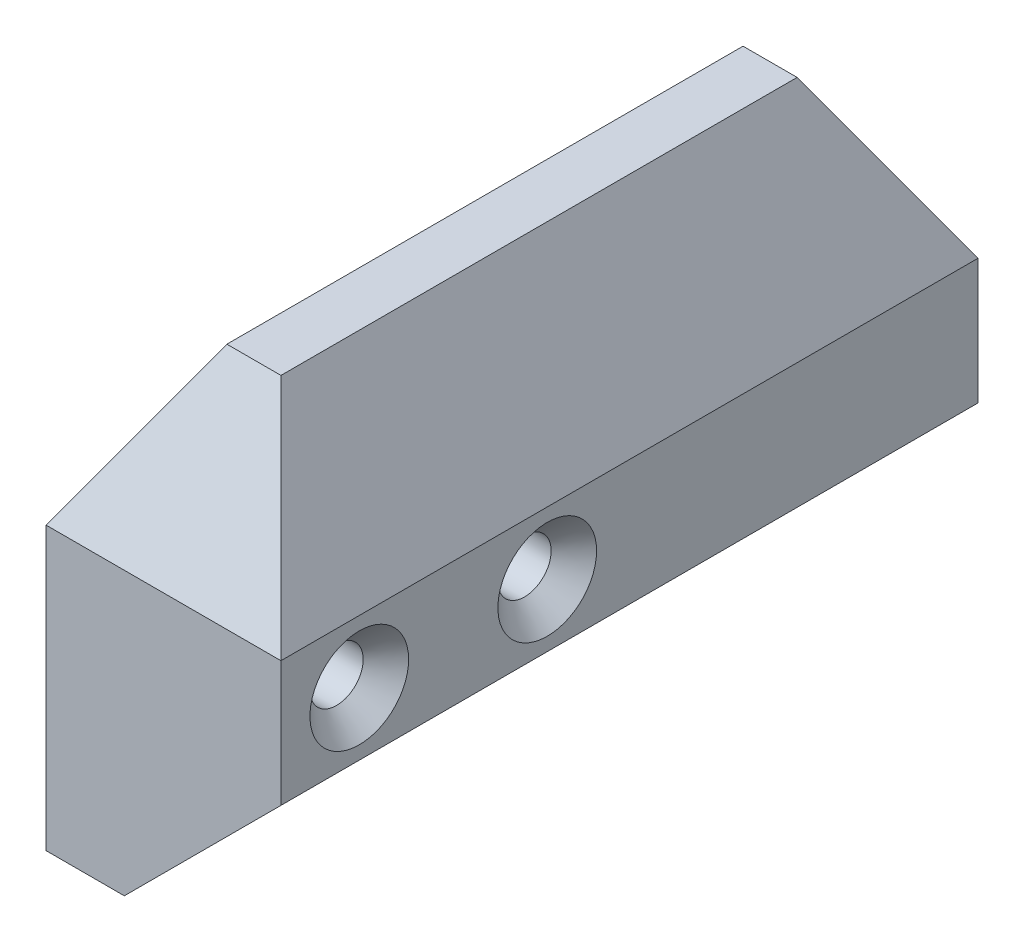
ISO-10303-21;
HEADER;
FILE_DESCRIPTION(('STEP AP214'),'2;1');
FILE_NAME('part.step','',(''),(''),'','','');
FILE_SCHEMA(('AUTOMOTIVE_DESIGN { 1 0 10303 214 1 1 1 1 }'));
ENDSEC;
DATA;
#1=APPLICATION_CONTEXT('core data for automotive mechanical design processes');
#2=APPLICATION_PROTOCOL_DEFINITION('international standard','automotive_design',2000,#1);
#3=PRODUCT_CONTEXT('',#1,'mechanical');
#4=PRODUCT('Part','Part','',(#3));
#5=PRODUCT_RELATED_PRODUCT_CATEGORY('part','',(#4));
#6=PRODUCT_DEFINITION_FORMATION('','',#4);
#7=PRODUCT_DEFINITION_CONTEXT('part definition',#1,'design');
#8=PRODUCT_DEFINITION('design','',#6,#7);
#9=PRODUCT_DEFINITION_SHAPE('','',#8);
#10=(LENGTH_UNIT() NAMED_UNIT(*) SI_UNIT(.MILLI.,.METRE.));
#11=(NAMED_UNIT(*) PLANE_ANGLE_UNIT() SI_UNIT($,.RADIAN.));
#12=(NAMED_UNIT(*) SI_UNIT($,.STERADIAN.) SOLID_ANGLE_UNIT());
#13=UNCERTAINTY_MEASURE_WITH_UNIT(LENGTH_MEASURE(1.E-05),#10,'distance_accuracy_value','');
#14=(GEOMETRIC_REPRESENTATION_CONTEXT(3) GLOBAL_UNCERTAINTY_ASSIGNED_CONTEXT((#13)) GLOBAL_UNIT_ASSIGNED_CONTEXT((#10,
#11,#12)) REPRESENTATION_CONTEXT('',''));
#15=CARTESIAN_POINT('',(0.,0.,0.));
#16=DIRECTION('',(0.,0.,1.));
#17=DIRECTION('',(1.,0.,0.));
#18=AXIS2_PLACEMENT_3D('',#15,#16,#17);
#19=CARTESIAN_POINT('',(0.,0.,44.5));
#20=DIRECTION('',(1.,0.,0.));
#21=DIRECTION('',(0.,0.,-1.));
#22=AXIS2_PLACEMENT_3D('',#19,#20,#21);
#23=PLANE('',#22);
#24=CARTESIAN_POINT('',(0.,4.,27.5));
#25=DIRECTION('',(1.,0.,0.));
#26=DIRECTION('',(0.,0.,-1.));
#27=AXIS2_PLACEMENT_3D('',#24,#25,#26);
#28=CIRCLE('',#27,1.7);
#29=CARTESIAN_POINT('',(0.,4.,25.8));
#30=VERTEX_POINT('',#29);
#31=EDGE_CURVE('E177',#30,#30,#28,.T.);
#32=ORIENTED_EDGE('',*,*,#31,.T.);
#33=EDGE_LOOP('',(#32));
#34=FACE_BOUND('',#33,.T.);
#35=CARTESIAN_POINT('',(0.,4.,39.5));
#36=DIRECTION('',(1.,0.,0.));
#37=DIRECTION('',(0.,0.,-1.));
#38=AXIS2_PLACEMENT_3D('',#35,#36,#37);
#39=CIRCLE('',#38,1.7);
#40=CARTESIAN_POINT('',(0.,4.,37.8));
#41=VERTEX_POINT('',#40);
#42=EDGE_CURVE('E119',#41,#41,#39,.T.);
#43=ORIENTED_EDGE('',*,*,#42,.T.);
#44=EDGE_LOOP('',(#43));
#45=FACE_BOUND('',#44,.T.);
#46=DIRECTION('',(0.,-1.,0.));
#47=VECTOR('',#46,1.);
#48=CARTESIAN_POINT('',(0.,0.,0.));
#49=LINE('',#48,#47);
#50=CARTESIAN_POINT('',(0.,8.,0.));
#51=VERTEX_POINT('',#50);
#52=CARTESIAN_POINT('',(0.,-10.,0.));
#53=VERTEX_POINT('',#52);
#54=EDGE_CURVE('E93',#51,#53,#49,.T.);
#55=ORIENTED_EDGE('',*,*,#54,.T.);
#56=DIRECTION('',(0.,0.,-1.));
#57=VECTOR('',#56,1.);
#58=CARTESIAN_POINT('',(0.,-10.,62.52775637732));
#59=LINE('',#58,#57);
#60=CARTESIAN_POINT('',(0.,-10.,44.5));
#61=VERTEX_POINT('',#60);
#62=EDGE_CURVE('E96',#61,#53,#59,.T.);
#63=ORIENTED_EDGE('',*,*,#62,.F.);
#64=DIRECTION('',(0.,-1.,0.));
#65=VECTOR('',#64,1.);
#66=CARTESIAN_POINT('',(0.,0.,44.5));
#67=LINE('',#66,#65);
#68=CARTESIAN_POINT('',(0.,8.,44.5));
#69=VERTEX_POINT('',#68);
#70=EDGE_CURVE('E145',#69,#61,#67,.T.);
#71=ORIENTED_EDGE('',*,*,#70,.F.);
#72=DIRECTION('',(0.,0.,-1.));
#73=VECTOR('',#72,1.);
#74=CARTESIAN_POINT('',(0.,8.,44.5));
#75=LINE('',#74,#73);
#76=EDGE_CURVE('E99',#69,#51,#75,.T.);
#77=ORIENTED_EDGE('',*,*,#76,.T.);
#78=EDGE_LOOP('',(#55,#63,#71,#77));
#79=FACE_BOUND('',#78,.T.);
#80=ADVANCED_FACE('F33',(#34,#45,#79),#23,.F.);
#81=CARTESIAN_POINT('',(15.,0.,44.5));
#82=DIRECTION('',(-1.,0.,0.));
#83=DIRECTION('',(0.,0.,1.));
#84=AXIS2_PLACEMENT_3D('',#81,#82,#83);
#85=PLANE('',#84);
#86=CARTESIAN_POINT('',(15.,4.,27.5));
#87=DIRECTION('',(1.,0.,0.));
#88=DIRECTION('',(0.,0.,-1.));
#89=AXIS2_PLACEMENT_3D('',#86,#87,#88);
#90=CIRCLE('',#89,3.15);
#91=CARTESIAN_POINT('',(15.,4.,24.35));
#92=VERTEX_POINT('',#91);
#93=EDGE_CURVE('E180',#92,#92,#90,.T.);
#94=ORIENTED_EDGE('',*,*,#93,.F.);
#95=EDGE_LOOP('',(#94));
#96=FACE_BOUND('',#95,.T.);
#97=CARTESIAN_POINT('',(15.,4.,39.5));
#98=DIRECTION('',(1.,0.,0.));
#99=DIRECTION('',(0.,0.,-1.));
#100=AXIS2_PLACEMENT_3D('',#97,#98,#99);
#101=CIRCLE('',#100,3.15);
#102=CARTESIAN_POINT('',(15.,4.,36.35));
#103=VERTEX_POINT('',#102);
#104=EDGE_CURVE('E171',#103,#103,#101,.T.);
#105=ORIENTED_EDGE('',*,*,#104,.F.);
#106=EDGE_LOOP('',(#105));
#107=FACE_BOUND('',#106,.T.);
#108=DIRECTION('',(0.,1.,0.));
#109=VECTOR('',#108,1.);
#110=CARTESIAN_POINT('',(15.,0.,0.));
#111=LINE('',#110,#109);
#112=CARTESIAN_POINT('',(15.,0.,0.));
#113=VERTEX_POINT('',#112);
#114=CARTESIAN_POINT('',(15.,8.,0.));
#115=VERTEX_POINT('',#114);
#116=EDGE_CURVE('E103',#113,#115,#111,.T.);
#117=ORIENTED_EDGE('',*,*,#116,.T.);
#118=DIRECTION('',(0.,0.,-1.));
#119=VECTOR('',#118,1.);
#120=CARTESIAN_POINT('',(15.,8.,44.5));
#121=LINE('',#120,#119);
#122=CARTESIAN_POINT('',(15.,8.,44.5));
#123=VERTEX_POINT('',#122);
#124=EDGE_CURVE('E41',#123,#115,#121,.T.);
#125=ORIENTED_EDGE('',*,*,#124,.F.);
#126=DIRECTION('',(0.,1.,0.));
#127=VECTOR('',#126,1.);
#128=CARTESIAN_POINT('',(15.,0.,44.5));
#129=LINE('',#128,#127);
#130=CARTESIAN_POINT('',(15.,0.,44.5));
#131=VERTEX_POINT('',#130);
#132=EDGE_CURVE('E147',#131,#123,#129,.T.);
#133=ORIENTED_EDGE('',*,*,#132,.F.);
#134=DIRECTION('',(0.,0.,-1.));
#135=VECTOR('',#134,1.);
#136=CARTESIAN_POINT('',(15.,0.,44.5));
#137=LINE('',#136,#135);
#138=EDGE_CURVE('E11',#131,#113,#137,.T.);
#139=ORIENTED_EDGE('',*,*,#138,.T.);
#140=EDGE_LOOP('',(#117,#125,#133,#139));
#141=FACE_BOUND('',#140,.T.);
#142=ADVANCED_FACE('F162',(#96,#107,#141),#85,.F.);
#143=CARTESIAN_POINT('',(9.22649730810372,18.,44.5));
#144=DIRECTION('',(-0.866025403784438,-0.500000000000001,0.));
#145=DIRECTION('',(0.500000000000002,-0.866025403784438,0.));
#146=AXIS2_PLACEMENT_3D('',#143,#144,#145);
#147=PLANE('',#146);
#148=ORIENTED_EDGE('',*,*,#124,.T.);
#149=DIRECTION('',(-0.447213595499959,0.774596669241482,0.447213595499959));
#150=VECTOR('',#149,1.);
#151=CARTESIAN_POINT('',(1.48119784648294,31.415252187363,13.518802153517));
#152=LINE('',#151,#150);
#153=CARTESIAN_POINT('',(9.22649730810372,18.,5.77350269189627));
#154=VERTEX_POINT('',#153);
#155=EDGE_CURVE('E136',#115,#154,#152,.T.);
#156=ORIENTED_EDGE('',*,*,#155,.T.);
#157=DIRECTION('',(0.,0.,-1.));
#158=VECTOR('',#157,1.);
#159=CARTESIAN_POINT('',(9.22649730810372,18.,44.5));
#160=LINE('',#159,#158);
#161=CARTESIAN_POINT('',(9.22649730810372,18.,38.7264973081037));
#162=VERTEX_POINT('',#161);
#163=EDGE_CURVE('E155',#162,#154,#160,.T.);
#164=ORIENTED_EDGE('',*,*,#163,.F.);
#165=DIRECTION('',(0.447213595499959,-0.774596669241482,0.447213595499959));
#166=VECTOR('',#165,1.);
#167=CARTESIAN_POINT('',(10.381197846483,16.,39.881197846483));
#168=LINE('',#167,#166);
#169=EDGE_CURVE('E104',#162,#123,#168,.T.);
#170=ORIENTED_EDGE('',*,*,#169,.T.);
#171=EDGE_LOOP('',(#148,#156,#164,#170));
#172=FACE_BOUND('',#171,.T.);
#173=ADVANCED_FACE('F160',(#172),#147,.F.);
#174=CARTESIAN_POINT('',(5.77350269189627,18.,44.5));
#175=DIRECTION('',(0.,-1.,0.));
#176=DIRECTION('',(1.,0.,0.));
#177=AXIS2_PLACEMENT_3D('',#174,#175,#176);
#178=PLANE('',#177);
#179=ORIENTED_EDGE('',*,*,#163,.T.);
#180=DIRECTION('',(1.,0.,0.));
#181=VECTOR('',#180,1.);
#182=CARTESIAN_POINT('',(15.,18.,5.77350269189627));
#183=LINE('',#182,#181);
#184=CARTESIAN_POINT('',(5.77350269189627,18.,5.77350269189627));
#185=VERTEX_POINT('',#184);
#186=EDGE_CURVE('E131',#185,#154,#183,.T.);
#187=ORIENTED_EDGE('',*,*,#186,.F.);
#188=DIRECTION('',(0.,0.,-1.));
#189=VECTOR('',#188,1.);
#190=CARTESIAN_POINT('',(5.77350269189627,18.,44.5));
#191=LINE('',#190,#189);
#192=CARTESIAN_POINT('',(5.77350269189627,18.,38.7264973081037));
#193=VERTEX_POINT('',#192);
#194=EDGE_CURVE('E152',#193,#185,#191,.T.);
#195=ORIENTED_EDGE('',*,*,#194,.F.);
#196=DIRECTION('',(-1.,0.,0.));
#197=VECTOR('',#196,1.);
#198=CARTESIAN_POINT('',(0.,18.,38.7264973081037));
#199=LINE('',#198,#197);
#200=EDGE_CURVE('E64',#162,#193,#199,.T.);
#201=ORIENTED_EDGE('',*,*,#200,.F.);
#202=EDGE_LOOP('',(#179,#187,#195,#201));
#203=FACE_BOUND('',#202,.T.);
#204=ADVANCED_FACE('F305',(#203),#178,.F.);
#205=CARTESIAN_POINT('',(0.,8.,44.5));
#206=DIRECTION('',(0.866025403784438,-0.500000000000001,0.));
#207=DIRECTION('',(0.500000000000001,0.866025403784438,0.));
#208=AXIS2_PLACEMENT_3D('',#205,#206,#207);
#209=PLANE('',#208);
#210=ORIENTED_EDGE('',*,*,#194,.T.);
#211=DIRECTION('',(-0.447213595499959,-0.774596669241482,-0.447213595499959));
#212=VECTOR('',#211,1.);
#213=CARTESIAN_POINT('',(8.90000000000003,23.415252187363,8.90000000000003));
#214=LINE('',#213,#212);
#215=EDGE_CURVE('E133',#185,#51,#214,.T.);
#216=ORIENTED_EDGE('',*,*,#215,.T.);
#217=ORIENTED_EDGE('',*,*,#76,.F.);
#218=DIRECTION('',(0.447213595499959,0.774596669241482,-0.447213595499959));
#219=VECTOR('',#218,1.);
#220=CARTESIAN_POINT('',(0.,8.,44.5));
#221=LINE('',#220,#219);
#222=EDGE_CURVE('E49',#69,#193,#221,.T.);
#223=ORIENTED_EDGE('',*,*,#222,.T.);
#224=EDGE_LOOP('',(#210,#216,#217,#223));
#225=FACE_BOUND('',#224,.T.);
#226=ADVANCED_FACE('F287',(#225),#209,.F.);
#227=CARTESIAN_POINT('',(0.,0.,44.5));
#228=DIRECTION('',(0.,0.,-1.));
#229=DIRECTION('',(-1.,0.,0.));
#230=AXIS2_PLACEMENT_3D('',#227,#228,#229);
#231=PLANE('',#230);
#232=ORIENTED_EDGE('',*,*,#132,.T.);
#233=DIRECTION('',(1.,0.,0.));
#234=VECTOR('',#233,1.);
#235=CARTESIAN_POINT('',(0.,8.,44.5));
#236=LINE('',#235,#234);
#237=EDGE_CURVE('E139',#69,#123,#236,.T.);
#238=ORIENTED_EDGE('',*,*,#237,.F.);
#239=ORIENTED_EDGE('',*,*,#70,.T.);
#240=DIRECTION('',(-1.,0.,0.));
#241=VECTOR('',#240,1.);
#242=CARTESIAN_POINT('',(0.,-10.,44.5));
#243=LINE('',#242,#241);
#244=CARTESIAN_POINT('',(5.,-10.,44.5));
#245=VERTEX_POINT('',#244);
#246=EDGE_CURVE('E112',#245,#61,#243,.T.);
#247=ORIENTED_EDGE('',*,*,#246,.F.);
#248=DIRECTION('',(-0.707106781186546,-0.707106781186549,0.));
#249=VECTOR('',#248,1.);
#250=CARTESIAN_POINT('',(5.,-10.,44.5));
#251=LINE('',#250,#249);
#252=EDGE_CURVE('E113',#131,#245,#251,.T.);
#253=ORIENTED_EDGE('',*,*,#252,.F.);
#254=EDGE_LOOP('',(#232,#238,#239,#247,#253));
#255=FACE_BOUND('',#254,.T.);
#256=ADVANCED_FACE('F277',(#255),#231,.F.);
#257=CARTESIAN_POINT('',(0.,0.,0.));
#258=DIRECTION('',(0.,0.,-1.));
#259=DIRECTION('',(-1.,0.,0.));
#260=AXIS2_PLACEMENT_3D('',#257,#258,#259);
#261=PLANE('',#260);
#262=DIRECTION('',(-1.,0.,0.));
#263=VECTOR('',#262,1.);
#264=CARTESIAN_POINT('',(15.,8.,0.));
#265=LINE('',#264,#263);
#266=EDGE_CURVE('E129',#115,#51,#265,.T.);
#267=ORIENTED_EDGE('',*,*,#266,.F.);
#268=ORIENTED_EDGE('',*,*,#116,.F.);
#269=DIRECTION('',(0.707106781186546,0.707106781186549,0.));
#270=VECTOR('',#269,1.);
#271=CARTESIAN_POINT('',(5.,-10.,0.));
#272=LINE('',#271,#270);
#273=CARTESIAN_POINT('',(5.,-10.,0.));
#274=VERTEX_POINT('',#273);
#275=EDGE_CURVE('E118',#274,#113,#272,.T.);
#276=ORIENTED_EDGE('',*,*,#275,.F.);
#277=DIRECTION('',(1.,0.,0.));
#278=VECTOR('',#277,1.);
#279=CARTESIAN_POINT('',(0.,-10.,0.));
#280=LINE('',#279,#278);
#281=EDGE_CURVE('E110',#53,#274,#280,.T.);
#282=ORIENTED_EDGE('',*,*,#281,.F.);
#283=ORIENTED_EDGE('',*,*,#54,.F.);
#284=EDGE_LOOP('',(#267,#268,#276,#282,#283));
#285=FACE_BOUND('',#284,.T.);
#286=ADVANCED_FACE('F116',(#285),#261,.T.);
#287=CARTESIAN_POINT('',(0.,21.2690652342038,36.8391016151377));
#288=DIRECTION('',(0.,-0.500000000000001,-0.866025403784438));
#289=DIRECTION('',(0.,0.866025403784438,-0.500000000000001));
#290=AXIS2_PLACEMENT_3D('',#287,#288,#289);
#291=PLANE('',#290);
#292=ORIENTED_EDGE('',*,*,#200,.T.);
#293=ORIENTED_EDGE('',*,*,#222,.F.);
#294=ORIENTED_EDGE('',*,*,#237,.T.);
#295=ORIENTED_EDGE('',*,*,#169,.F.);
#296=EDGE_LOOP('',(#292,#293,#294,#295));
#297=FACE_BOUND('',#296,.T.);
#298=ADVANCED_FACE('F276',(#297),#291,.F.);
#299=CARTESIAN_POINT('',(0.,2.00000000000001,-3.46410161513776));
#300=DIRECTION('',(0.,-0.500000000000001,0.866025403784438));
#301=DIRECTION('',(0.,-0.866025403784438,-0.500000000000001));
#302=AXIS2_PLACEMENT_3D('',#299,#300,#301);
#303=PLANE('',#302);
#304=ORIENTED_EDGE('',*,*,#266,.T.);
#305=ORIENTED_EDGE('',*,*,#215,.F.);
#306=ORIENTED_EDGE('',*,*,#186,.T.);
#307=ORIENTED_EDGE('',*,*,#155,.F.);
#308=EDGE_LOOP('',(#304,#305,#306,#307));
#309=FACE_BOUND('',#308,.T.);
#310=ADVANCED_FACE('F266',(#309),#303,.F.);
#311=CARTESIAN_POINT('',(5.,-10.,62.52775637732));
#312=DIRECTION('',(-0.707106781186549,0.707106781186546,0.));
#313=DIRECTION('',(-0.707106781186546,-0.707106781186549,0.));
#314=AXIS2_PLACEMENT_3D('',#311,#312,#313);
#315=PLANE('',#314);
#316=ORIENTED_EDGE('',*,*,#138,.F.);
#317=ORIENTED_EDGE('',*,*,#252,.T.);
#318=DIRECTION('',(0.,0.,-1.));
#319=VECTOR('',#318,1.);
#320=CARTESIAN_POINT('',(5.,-10.,62.52775637732));
#321=LINE('',#320,#319);
#322=EDGE_CURVE('E114',#245,#274,#321,.T.);
#323=ORIENTED_EDGE('',*,*,#322,.T.);
#324=ORIENTED_EDGE('',*,*,#275,.T.);
#325=EDGE_LOOP('',(#316,#317,#323,#324));
#326=FACE_BOUND('',#325,.T.);
#327=ADVANCED_FACE('F165',(#326),#315,.F.);
#328=CARTESIAN_POINT('',(0.,-10.,62.52775637732));
#329=DIRECTION('',(0.,1.,0.));
#330=DIRECTION('',(0.,0.,1.));
#331=AXIS2_PLACEMENT_3D('',#328,#329,#330);
#332=PLANE('',#331);
#333=ORIENTED_EDGE('',*,*,#322,.F.);
#334=ORIENTED_EDGE('',*,*,#246,.T.);
#335=ORIENTED_EDGE('',*,*,#62,.T.);
#336=ORIENTED_EDGE('',*,*,#281,.T.);
#337=EDGE_LOOP('',(#333,#334,#335,#336));
#338=FACE_BOUND('',#337,.T.);
#339=ADVANCED_FACE('F109',(#338),#332,.F.);
#340=CARTESIAN_POINT('',(15.,4.,39.5));
#341=DIRECTION('',(1.,0.,0.));
#342=DIRECTION('',(0.,0.,-1.));
#343=AXIS2_PLACEMENT_3D('',#340,#341,#342);
#344=CYLINDRICAL_SURFACE('',#343,1.7);
#345=ORIENTED_EDGE('',*,*,#42,.F.);
#346=EDGE_LOOP('',(#345));
#347=FACE_BOUND('',#346,.T.);
#348=CARTESIAN_POINT('',(13.55,4.,39.5));
#349=DIRECTION('',(1.,0.,0.));
#350=DIRECTION('',(0.,0.,-1.));
#351=AXIS2_PLACEMENT_3D('',#348,#349,#350);
#352=CIRCLE('',#351,1.7);
#353=CARTESIAN_POINT('',(13.55,4.,37.8));
#354=VERTEX_POINT('',#353);
#355=EDGE_CURVE('E123',#354,#354,#352,.T.);
#356=ORIENTED_EDGE('',*,*,#355,.T.);
#357=EDGE_LOOP('',(#356));
#358=FACE_BOUND('',#357,.T.);
#359=ADVANCED_FACE('F193',(#347,#358),#344,.F.);
#360=CARTESIAN_POINT('',(15.,4.,39.5));
#361=DIRECTION('',(1.,0.,0.));
#362=DIRECTION('',(0.,0.,-1.));
#363=AXIS2_PLACEMENT_3D('',#360,#361,#362);
#364=CONICAL_SURFACE('',#363,3.15,0.785398163397448);
#365=ORIENTED_EDGE('',*,*,#355,.F.);
#366=EDGE_LOOP('',(#365));
#367=FACE_BOUND('',#366,.T.);
#368=ORIENTED_EDGE('',*,*,#104,.T.);
#369=EDGE_LOOP('',(#368));
#370=FACE_BOUND('',#369,.T.);
#371=ADVANCED_FACE('F190',(#367,#370),#364,.F.);
#372=CARTESIAN_POINT('',(15.,4.,27.5));
#373=DIRECTION('',(1.,0.,0.));
#374=DIRECTION('',(0.,0.,-1.));
#375=AXIS2_PLACEMENT_3D('',#372,#373,#374);
#376=CYLINDRICAL_SURFACE('',#375,1.7);
#377=ORIENTED_EDGE('',*,*,#31,.F.);
#378=EDGE_LOOP('',(#377));
#379=FACE_BOUND('',#378,.T.);
#380=CARTESIAN_POINT('',(13.55,4.,27.5));
#381=DIRECTION('',(1.,0.,0.));
#382=DIRECTION('',(0.,0.,-1.));
#383=AXIS2_PLACEMENT_3D('',#380,#381,#382);
#384=CIRCLE('',#383,1.7);
#385=CARTESIAN_POINT('',(13.55,4.,25.8));
#386=VERTEX_POINT('',#385);
#387=EDGE_CURVE('E174',#386,#386,#384,.T.);
#388=ORIENTED_EDGE('',*,*,#387,.T.);
#389=EDGE_LOOP('',(#388));
#390=FACE_BOUND('',#389,.T.);
#391=ADVANCED_FACE('F192',(#379,#390),#376,.F.);
#392=CARTESIAN_POINT('',(15.,4.,27.5));
#393=DIRECTION('',(1.,0.,0.));
#394=DIRECTION('',(0.,0.,-1.));
#395=AXIS2_PLACEMENT_3D('',#392,#393,#394);
#396=CONICAL_SURFACE('',#395,3.15,0.785398163397448);
#397=ORIENTED_EDGE('',*,*,#387,.F.);
#398=EDGE_LOOP('',(#397));
#399=FACE_BOUND('',#398,.T.);
#400=ORIENTED_EDGE('',*,*,#93,.T.);
#401=EDGE_LOOP('',(#400));
#402=FACE_BOUND('',#401,.T.);
#403=ADVANCED_FACE('F184',(#399,#402),#396,.F.);
#404=CLOSED_SHELL('',(#80,#142,#173,#204,#226,#256,#286,#298,#310,#327,#339,#359,#371,#391,#403));
#405=MANIFOLD_SOLID_BREP('B2',#404);
#406=ADVANCED_BREP_SHAPE_REPRESENTATION('',(#18,#405),#14);
#407=SHAPE_DEFINITION_REPRESENTATION(#9,#406);
ENDSEC;
END-ISO-10303-21;
